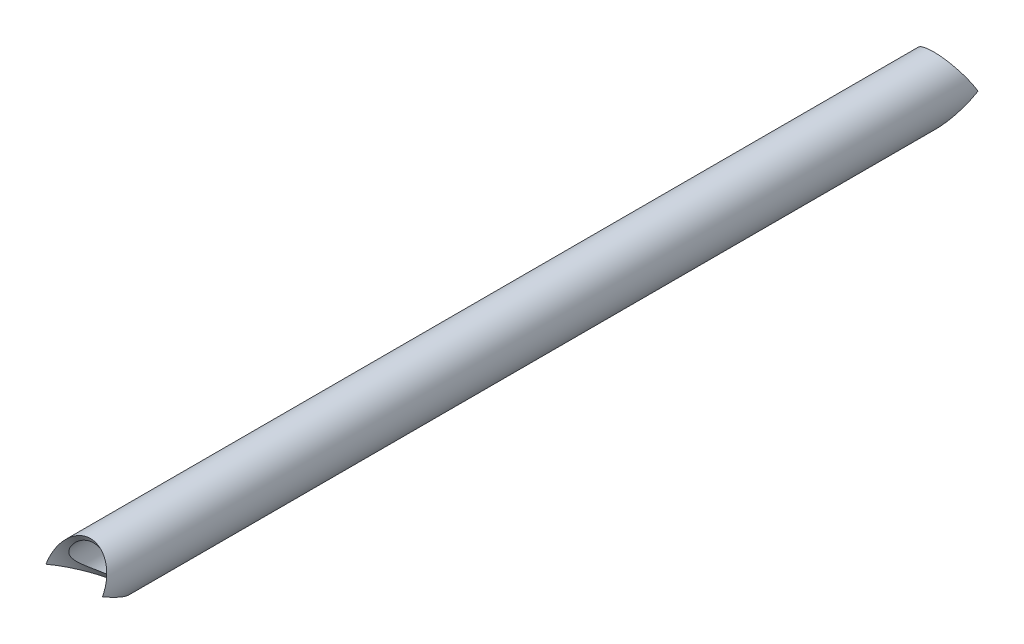
ISO-10303-21;
HEADER;
FILE_DESCRIPTION(('STEP AP214'),'2;1');
FILE_NAME('part.step','',(''),(''),'','','');
FILE_SCHEMA(('AUTOMOTIVE_DESIGN { 1 0 10303 214 1 1 1 1 }'));
ENDSEC;
DATA;
#1=APPLICATION_CONTEXT('core data for automotive mechanical design processes');
#2=APPLICATION_PROTOCOL_DEFINITION('international standard','automotive_design',2000,#1);
#3=PRODUCT_CONTEXT('',#1,'mechanical');
#4=PRODUCT('Part','Part','',(#3));
#5=PRODUCT_RELATED_PRODUCT_CATEGORY('part','',(#4));
#6=PRODUCT_DEFINITION_FORMATION('','',#4);
#7=PRODUCT_DEFINITION_CONTEXT('part definition',#1,'design');
#8=PRODUCT_DEFINITION('design','',#6,#7);
#9=PRODUCT_DEFINITION_SHAPE('','',#8);
#10=(LENGTH_UNIT() NAMED_UNIT(*) SI_UNIT(.MILLI.,.METRE.));
#11=(NAMED_UNIT(*) PLANE_ANGLE_UNIT() SI_UNIT($,.RADIAN.));
#12=(NAMED_UNIT(*) SI_UNIT($,.STERADIAN.) SOLID_ANGLE_UNIT());
#13=UNCERTAINTY_MEASURE_WITH_UNIT(LENGTH_MEASURE(1.E-05),#10,'distance_accuracy_value','');
#14=(GEOMETRIC_REPRESENTATION_CONTEXT(3) GLOBAL_UNCERTAINTY_ASSIGNED_CONTEXT((#13)) GLOBAL_UNIT_ASSIGNED_CONTEXT((#10,
#11,#12)) REPRESENTATION_CONTEXT('',''));
#15=CARTESIAN_POINT('',(0.,0.,0.));
#16=DIRECTION('',(0.,0.,1.));
#17=DIRECTION('',(1.,0.,0.));
#18=AXIS2_PLACEMENT_3D('',#15,#16,#17);
#19=CARTESIAN_POINT('',(7.95896546008941E-13,-103.327540378658,-184.657183251993));
#20=DIRECTION('',(0.,0.,1.));
#21=DIRECTION('',(1.,0.,0.));
#22=AXIS2_PLACEMENT_3D('',#19,#20,#21);
#23=CYLINDRICAL_SURFACE('',#22,10.65);
#24=CARTESIAN_POINT('',(5.33912472263224E-13,-103.327540378658,-165.343816747654));
#25=DIRECTION('',(0.,0.866025403784403,0.500000000000061));
#26=DIRECTION('',(0.,-0.500000000000061,0.866025403784403));
#27=AXIS2_PLACEMENT_3D('',#24,#25,#26);
#28=ELLIPSE('',#27,21.2999999999974,10.65);
#29=CARTESIAN_POINT('',(-10.6499999999995,-103.327540378658,-165.343816747654));
#30=VERTEX_POINT('',#29);
#31=CARTESIAN_POINT('',(10.6500000000005,-103.327540378658,-165.343816747654));
#32=VERTEX_POINT('',#31);
#33=EDGE_CURVE('E46',#30,#32,#28,.T.);
#34=ORIENTED_EDGE('',*,*,#33,.T.);
#35=CARTESIAN_POINT('',(5.33912472263224E-13,-103.327540378658,-165.343816747654));
#36=DIRECTION('',(0.,-0.500000000000061,0.866025403784403));
#37=DIRECTION('',(0.,0.866025403784403,0.500000000000061));
#38=AXIS2_PLACEMENT_3D('',#35,#36,#37);
#39=ELLIPSE('',#38,12.2975607337395,10.65);
#40=EDGE_CURVE('E54',#32,#30,#39,.T.);
#41=ORIENTED_EDGE('',*,*,#40,.T.);
#42=EDGE_LOOP('',(#34,#41));
#43=FACE_BOUND('',#42,.T.);
#44=CARTESIAN_POINT('',(5.33912472263224E-13,-103.327540378658,165.343816747654));
#45=DIRECTION('',(0.,-0.866025403784403,0.500000000000061));
#46=DIRECTION('',(0.,-0.500000000000061,-0.866025403784403));
#47=AXIS2_PLACEMENT_3D('',#44,#45,#46);
#48=ELLIPSE('',#47,21.2999999999974,10.65);
#49=CARTESIAN_POINT('',(-10.6499999999995,-103.327540378658,165.343816747654));
#50=VERTEX_POINT('',#49);
#51=CARTESIAN_POINT('',(10.6500000000005,-103.327540378658,165.343816747654));
#52=VERTEX_POINT('',#51);
#53=EDGE_CURVE('E64',#50,#52,#48,.T.);
#54=ORIENTED_EDGE('',*,*,#53,.F.);
#55=CARTESIAN_POINT('',(5.33912472263224E-13,-103.327540378658,165.343816747654));
#56=DIRECTION('',(0.,0.500000000000061,0.866025403784403));
#57=DIRECTION('',(0.,0.866025403784403,-0.500000000000061));
#58=AXIS2_PLACEMENT_3D('',#55,#56,#57);
#59=ELLIPSE('',#58,12.2975607337395,10.65);
#60=EDGE_CURVE('E62',#52,#50,#59,.T.);
#61=ORIENTED_EDGE('',*,*,#60,.F.);
#62=EDGE_LOOP('',(#54,#61));
#63=FACE_BOUND('',#62,.T.);
#64=ADVANCED_FACE('F35',(#43,#63),#23,.T.);
#65=CARTESIAN_POINT('',(7.95896546008941E-13,-103.327540378658,-184.657183251993));
#66=DIRECTION('',(0.,0.,1.));
#67=DIRECTION('',(1.,0.,0.));
#68=AXIS2_PLACEMENT_3D('',#65,#66,#67);
#69=CYLINDRICAL_SURFACE('',#68,8.65);
#70=CARTESIAN_POINT('',(8.6500000000008,-103.327540378658,-158.169789519754));
#71=CARTESIAN_POINT('',(8.64999937803406,-103.180724296699,-158.254553812038));
#72=CARTESIAN_POINT('',(8.64626274910786,-103.031296103445,-158.334805870627));
#73=CARTESIAN_POINT('',(8.63051404007087,-102.727691030107,-158.484871683247));
#74=CARTESIAN_POINT('',(8.61850310980585,-102.573514812682,-158.554686886004));
#75=CARTESIAN_POINT('',(8.58549136002989,-102.261518046835,-158.682598958172));
#76=CARTESIAN_POINT('',(8.56450206368836,-102.103702414163,-158.740710708101));
#77=CARTESIAN_POINT('',(8.51297710355504,-101.785568281509,-158.844571007119));
#78=CARTESIAN_POINT('',(8.48244146927675,-101.625249789266,-158.890319594429));
#79=CARTESIAN_POINT('',(8.41148621827999,-101.303544973736,-158.969357821427));
#80=CARTESIAN_POINT('',(8.37105601253871,-101.142157687871,-159.002634016121));
#81=CARTESIAN_POINT('',(8.28030697487776,-100.820150897027,-159.057180023658));
#82=CARTESIAN_POINT('',(8.22998781020971,-100.659531418069,-159.078449432399));
#83=CARTESIAN_POINT('',(8.11955918288921,-100.340258608292,-159.110075644565));
#84=CARTESIAN_POINT('',(8.05943008935794,-100.181609920802,-159.120410249133));
#85=CARTESIAN_POINT('',(7.92980127102047,-99.8678307830811,-159.131499808773));
#86=CARTESIAN_POINT('',(7.86029883349743,-99.7127013665945,-159.13225198458));
#87=CARTESIAN_POINT('',(7.69251740767398,-99.3659705295927,-159.124832713928));
#88=CARTESIAN_POINT('',(7.59151815094415,-99.1757360991384,-159.114215817948));
#89=CARTESIAN_POINT('',(7.37601667855964,-98.8039252937172,-159.0831105074));
#90=CARTESIAN_POINT('',(7.26151062378817,-98.6223514010809,-159.062619281063));
#91=CARTESIAN_POINT('',(7.01974442801524,-98.2687263772869,-159.014496823717));
#92=CARTESIAN_POINT('',(6.89247464409802,-98.0966826007281,-158.986860169128));
#93=CARTESIAN_POINT('',(6.62602035216192,-97.7630152066561,-158.926814802403));
#94=CARTESIAN_POINT('',(6.48683667995988,-97.6013908595618,-158.894406424912));
#95=CARTESIAN_POINT('',(6.19369921715803,-97.2853409697255,-158.825971691225));
#96=CARTESIAN_POINT('',(6.03946719637312,-97.1311886364477,-158.789876171353));
#97=CARTESIAN_POINT('',(5.71996280968018,-96.835085796674,-158.716544919854));
#98=CARTESIAN_POINT('',(5.5546903958322,-96.6931353431676,-158.679309183277));
#99=CARTESIAN_POINT('',(5.21389860048002,-96.4220971493093,-158.605207765951));
#100=CARTESIAN_POINT('',(5.03838164400033,-96.2930063843177,-158.568342000028));
#101=CARTESIAN_POINT('',(4.67787691764224,-96.0482936158515,-158.496242664673));
#102=CARTESIAN_POINT('',(4.49288897525261,-95.9326718578367,-158.461009124995));
#103=CARTESIAN_POINT('',(4.08963935720836,-95.7013898776149,-158.388840354312));
#104=CARTESIAN_POINT('',(3.87018262639335,-95.5876872173255,-158.352281476095));
#105=CARTESIAN_POINT('',(3.42170434916215,-95.3792328977603,-158.283945399876));
#106=CARTESIAN_POINT('',(3.19268197861234,-95.2844828754487,-158.252168614968));
#107=CARTESIAN_POINT('',(2.72667233822171,-95.1147913964146,-158.194467434627));
#108=CARTESIAN_POINT('',(2.48968464132816,-95.0398510036805,-158.168543353557));
#109=CARTESIAN_POINT('',(2.00954587057643,-94.9105320669982,-158.123393090708));
#110=CARTESIAN_POINT('',(1.76639521489099,-94.8561521319339,-158.104166455787));
#111=CARTESIAN_POINT('',(1.28688815578064,-94.7704940023502,-158.073718574908));
#112=CARTESIAN_POINT('',(1.05071773862643,-94.7382871368125,-158.062176291935));
#113=CARTESIAN_POINT('',(0.576287751522929,-94.6934706793493,-158.046083469594));
#114=CARTESIAN_POINT('',(0.338028232849841,-94.6808606077744,-158.0415327591));
#115=CARTESIAN_POINT('',(-0.138694398065103,-94.6753685684628,-158.039552924422));
#116=CARTESIAN_POINT('',(-0.377157454409519,-94.6824822883534,-158.042122243526));
#117=CARTESIAN_POINT('',(-0.852499060907802,-94.7163548205199,-158.054306137961));
#118=CARTESIAN_POINT('',(-1.08937763949897,-94.7431132792635,-158.063920586505));
#119=CARTESIAN_POINT('',(-1.55084699909949,-94.8146198945567,-158.089426565577));
#120=CARTESIAN_POINT('',(-1.77556361879874,-94.8586491722921,-158.105066862775));
#121=CARTESIAN_POINT('',(-2.22033596035071,-94.964236643383,-158.142195625723));
#122=CARTESIAN_POINT('',(-2.44039182888856,-95.025794284195,-158.163683907127));
#123=CARTESIAN_POINT('',(-2.87439182216376,-95.1659005896107,-158.21192308881));
#124=CARTESIAN_POINT('',(-3.08833678882493,-95.2444469007086,-158.238673260093));
#125=CARTESIAN_POINT('',(-3.50884695014992,-95.4179115519313,-158.296692885398));
#126=CARTESIAN_POINT('',(-3.71541192514849,-95.5128303788942,-158.327962473801));
#127=CARTESIAN_POINT('',(-4.12561504865866,-95.7212148758505,-158.395031462038));
#128=CARTESIAN_POINT('',(-4.32901148650071,-95.835123437807,-158.430932760268));
#129=CARTESIAN_POINT('',(-4.72560996425141,-96.0787283889239,-158.505363145841));
#130=CARTESIAN_POINT('',(-4.91881176220131,-96.2084251525588,-158.543892295503));
#131=CARTESIAN_POINT('',(-5.29426000335201,-96.4830183554264,-158.622226257314));
#132=CARTESIAN_POINT('',(-5.47649012979044,-96.6279365940557,-158.662032840722));
#133=CARTESIAN_POINT('',(-5.82873985001061,-96.9320391578018,-158.74118278452));
#134=CARTESIAN_POINT('',(-5.99875927649417,-97.0912236783131,-158.780526138557));
#135=CARTESIAN_POINT('',(-6.3351876587697,-97.4327427072261,-158.858947720757));
#136=CARTESIAN_POINT('',(-6.50081325634362,-97.615884819436,-158.897877805471));
#137=CARTESIAN_POINT('',(-6.81634213928482,-97.9963986397084,-158.970062290325));
#138=CARTESIAN_POINT('',(-6.96624167784245,-98.193773720029,-159.003315339061));
#139=CARTESIAN_POINT('',(-7.24880778216957,-98.601166616171,-159.060509557127));
#140=CARTESIAN_POINT('',(-7.38151120832191,-98.8111559288453,-159.084470871023));
#141=CARTESIAN_POINT('',(-7.62872444595239,-99.2425978528779,-159.118913729354));
#142=CARTESIAN_POINT('',(-7.7432466153069,-99.4640425410581,-159.129404464472));
#143=CARTESIAN_POINT('',(-7.91587661528727,-99.8364815794788,-159.131660792954));
#144=CARTESIAN_POINT('',(-7.9796532846007,-99.9848392003673,-159.128717442529));
#145=CARTESIAN_POINT('',(-8.09865941914346,-100.28448705044,-159.11386568408));
#146=CARTESIAN_POINT('',(-8.15389168150537,-100.435776301586,-159.10196021745));
#147=CARTESIAN_POINT('',(-8.25543809691465,-100.739897889786,-159.068058126632));
#148=CARTESIAN_POINT('',(-8.30176915263711,-100.892726710425,-159.046080902158));
#149=CARTESIAN_POINT('',(-8.3854938845684,-101.19888471671,-158.991192865948));
#150=CARTESIAN_POINT('',(-8.42288752849199,-101.352213904162,-158.958282014718));
#151=CARTESIAN_POINT('',(-8.48887463244742,-101.658377748636,-158.881026848016));
#152=CARTESIAN_POINT('',(-8.51744234753692,-101.81120969583,-158.83664976459));
#153=CARTESIAN_POINT('',(-8.56590540255613,-102.114543369102,-158.736664024524));
#154=CARTESIAN_POINT('',(-8.5858008185466,-102.265045115606,-158.681055466398));
#155=CARTESIAN_POINT('',(-8.61742448664778,-102.562731851217,-158.559202943871));
#156=CARTESIAN_POINT('',(-8.62914387610698,-102.709913074293,-158.492947533877));
#157=CARTESIAN_POINT('',(-8.64501885033538,-103.000021072934,-158.350865710912));
#158=CARTESIAN_POINT('',(-8.64917188259922,-103.142946396787,-158.275036077306));
#159=CARTESIAN_POINT('',(-8.65091176420805,-103.484490242439,-158.080636711664));
#160=CARTESIAN_POINT('',(-8.64490991978731,-103.680647580873,-157.957703743245));
#161=CARTESIAN_POINT('',(-8.6208040453725,-104.063065952511,-157.698392769579));
#162=CARTESIAN_POINT('',(-8.60269349220063,-104.249321593078,-157.562007551141));
#163=CARTESIAN_POINT('',(-8.55591593176066,-104.61304776465,-157.278573186889));
#164=CARTESIAN_POINT('',(-8.5272145391973,-104.790487519854,-157.131490572831));
#165=CARTESIAN_POINT('',(-8.46048539057249,-105.136909100512,-156.829617762131));
#166=CARTESIAN_POINT('',(-8.42245385331453,-105.305887463331,-156.674824460923));
#167=CARTESIAN_POINT('',(-8.33930780952858,-105.630942586702,-156.364734704409));
#168=CARTESIAN_POINT('',(-8.2944623361027,-105.787259894665,-156.209616629036));
#169=CARTESIAN_POINT('',(-8.19738755509969,-106.093611441076,-155.895606806495));
#170=CARTESIAN_POINT('',(-8.14515935111348,-106.243646614258,-155.736715626289));
#171=CARTESIAN_POINT('',(-8.03358147622551,-106.538288577141,-155.416145966346));
#172=CARTESIAN_POINT('',(-7.9742252188266,-106.682890181606,-155.254465028759));
#173=CARTESIAN_POINT('',(-7.84858289044733,-106.967098976708,-154.929390007544));
#174=CARTESIAN_POINT('',(-7.78229605383257,-107.106705613251,-154.76599573644));
#175=CARTESIAN_POINT('',(-7.64278789689112,-107.381432345415,-154.438214400526));
#176=CARTESIAN_POINT('',(-7.56956237191814,-107.51654965279,-154.273826790994));
#177=CARTESIAN_POINT('',(-7.41613086611494,-107.782546269707,-153.944852851689));
#178=CARTESIAN_POINT('',(-7.33592422353043,-107.913425175865,-153.780266504538));
#179=CARTESIAN_POINT('',(-7.16842967186045,-108.171062672443,-153.45168082809));
#180=CARTESIAN_POINT('',(-7.08114669097887,-108.297824045729,-153.287681171914));
#181=CARTESIAN_POINT('',(-6.89920629382288,-108.547434846444,-152.960798311847));
#182=CARTESIAN_POINT('',(-6.80454875726898,-108.670284210023,-152.797915126214));
#183=CARTESIAN_POINT('',(-6.56519981119175,-108.964065146199,-152.404283892078));
#184=CARTESIAN_POINT('',(-6.41648661666439,-109.132974471902,-152.174449414939));
#185=CARTESIAN_POINT('',(-6.10210401419077,-109.462578998742,-151.720441483466));
#186=CARTESIAN_POINT('',(-5.93643204735793,-109.62327295477,-151.496268889828));
#187=CARTESIAN_POINT('',(-5.58706670598616,-109.935256053793,-151.056650105889));
#188=CARTESIAN_POINT('',(-5.40341885193462,-110.086567444865,-150.841183730296));
#189=CARTESIAN_POINT('',(-5.01605964050909,-110.378816276582,-150.421588491305));
#190=CARTESIAN_POINT('',(-4.8123586935434,-110.519759034309,-150.217453830321));
#191=CARTESIAN_POINT('',(-4.46395431537738,-110.73837637967,-149.898697996367));
#192=CARTESIAN_POINT('',(-4.32596965085759,-110.819866914022,-149.779349834344));
#193=CARTESIAN_POINT('',(-4.04104693269419,-110.977308595896,-149.547914824573));
#194=CARTESIAN_POINT('',(-3.89410768993995,-111.05325900477,-149.435828945307));
#195=CARTESIAN_POINT('',(-3.43953622820747,-111.271403809869,-149.112868323666));
#196=CARTESIAN_POINT('',(-3.11767000653529,-111.404200907743,-148.914838120572));
#197=CARTESIAN_POINT('',(-2.51329904826334,-111.60902720045,-148.608135136498));
#198=CARTESIAN_POINT('',(-2.23837288737241,-111.68800742512,-148.489382239451));
#199=CARTESIAN_POINT('',(-1.8114918358848,-111.78699632269,-148.340230769187));
#200=CARTESIAN_POINT('',(-1.66677696284385,-111.816746490483,-148.295342080614));
#201=CARTESIAN_POINT('',(-1.37323763265746,-111.869139042039,-148.216221017434));
#202=CARTESIAN_POINT('',(-1.22441515227349,-111.891784782047,-148.181983611057));
#203=CARTESIAN_POINT('',(-0.922228530534153,-111.92959793131,-148.124783054174));
#204=CARTESIAN_POINT('',(-0.768835207762047,-111.944694647389,-148.101926488186));
#205=CARTESIAN_POINT('',(-0.460111209938452,-111.966680344282,-148.068631454903));
#206=CARTESIAN_POINT('',(-0.304780550296065,-111.973569390335,-148.058192888903));
#207=CARTESIAN_POINT('',(0.00631804623179663,-111.978936613017,-148.050060702468));
#208=CARTESIAN_POINT('',(0.162085851107407,-111.977417102303,-148.052363577676));
#209=CARTESIAN_POINT('',(0.472597570433432,-111.966017450406,-148.06963393631));
#210=CARTESIAN_POINT('',(0.627341552834955,-111.956137869807,-148.084600570568));
#211=CARTESIAN_POINT('',(0.914629127249672,-111.930098311039,-148.124021691108));
#212=CARTESIAN_POINT('',(1.04746675019326,-111.91491027634,-148.147007166989));
#213=CARTESIAN_POINT('',(1.31053948151417,-111.878717870489,-148.201737163545));
#214=CARTESIAN_POINT('',(1.44077378597111,-111.857711731536,-148.233484346408));
#215=CARTESIAN_POINT('',(1.82650942834381,-111.786537386547,-148.340945568136));
#216=CARTESIAN_POINT('',(2.07716005820174,-111.728202180101,-148.428896105986));
#217=CARTESIAN_POINT('',(2.6770104496419,-111.561247115626,-148.679841546537));
#218=CARTESIAN_POINT('',(3.01657143771898,-111.441900151343,-148.85864494834));
#219=CARTESIAN_POINT('',(3.49694388024381,-111.241087387271,-149.157554671786));
#220=CARTESIAN_POINT('',(3.65245291749765,-111.170394301879,-149.262490672566));
#221=CARTESIAN_POINT('',(3.95415605806268,-111.02268825471,-149.4809699569));
#222=CARTESIAN_POINT('',(4.10035178316947,-110.945676398639,-149.594511734284));
#223=CARTESIAN_POINT('',(4.47217067277788,-110.736454003811,-149.901738381406));
#224=CARTESIAN_POINT('',(4.69046621582154,-110.599772252971,-150.101242865483));
#225=CARTESIAN_POINT('',(5.1054204024205,-110.314712608095,-150.513982184282));
#226=CARTESIAN_POINT('',(5.30206445824779,-110.166326942669,-150.727226124491));
#227=CARTESIAN_POINT('',(5.67619689273802,-109.859160627466,-151.1643842946));
#228=CARTESIAN_POINT('',(5.85361633779502,-109.700345650149,-151.388333025582));
#229=CARTESIAN_POINT('',(6.1902113126006,-109.373922501287,-151.843247922582));
#230=CARTESIAN_POINT('',(6.34939068740995,-109.206316193879,-152.074212596584));
#231=CARTESIAN_POINT('',(6.61712450602785,-108.901368184084,-152.488481148617));
#232=CARTESIAN_POINT('',(6.72902472853619,-108.765672649512,-152.670852702975));
#233=CARTESIAN_POINT('',(6.94326792392784,-108.48933327863,-153.037486843968));
#234=CARTESIAN_POINT('',(7.04560988610157,-108.348688921182,-153.221749628305));
#235=CARTESIAN_POINT('',(7.24122557898546,-108.062227649819,-153.591407563421));
#236=CARTESIAN_POINT('',(7.3344900619312,-107.916405663289,-153.776803668649));
#237=CARTESIAN_POINT('',(7.51210861764736,-107.619469408038,-154.147609115808));
#238=CARTESIAN_POINT('',(7.59646314201739,-107.46835540806,-154.333018456591));
#239=CARTESIAN_POINT('',(7.75620337110453,-107.160785238078,-154.702402158736));
#240=CARTESIAN_POINT('',(7.83161100983237,-107.004343395916,-154.886378951062));
#241=CARTESIAN_POINT('',(7.97368173187833,-106.685132953883,-155.252263242759));
#242=CARTESIAN_POINT('',(8.04034383363487,-106.522363646498,-155.434170507767));
#243=CARTESIAN_POINT('',(8.16459670931791,-106.18993611332,-155.794291758741));
#244=CARTESIAN_POINT('',(8.22219981237345,-106.020287652741,-155.972510472611));
#245=CARTESIAN_POINT('',(8.32794134031561,-105.672930442118,-156.323768111229));
#246=CARTESIAN_POINT('',(8.37608284212309,-105.495224335641,-156.496808704336));
#247=CARTESIAN_POINT('',(8.45472823516548,-105.161709857086,-156.806582126685));
#248=CARTESIAN_POINT('',(8.48684042867082,-105.007352499218,-156.944464160928));
#249=CARTESIAN_POINT('',(8.54328935211273,-104.691521887395,-157.213577397615));
#250=CARTESIAN_POINT('',(8.56762596647589,-104.530048527711,-157.344808501177));
#251=CARTESIAN_POINT('',(8.60751619567207,-104.199759172313,-157.598297745706));
#252=CARTESIAN_POINT('',(8.62309164938126,-104.030962573905,-157.720577531033));
#253=CARTESIAN_POINT('',(8.64433263886661,-103.685277201269,-157.954115038791));
#254=CARTESIAN_POINT('',(8.65000076614843,-103.508390555619,-158.065375636378));
#255=CARTESIAN_POINT('',(8.6500000000008,-103.327540378658,-158.169789519754));
#256=B_SPLINE_CURVE_WITH_KNOTS('',3,(#70,#71,#72,#73,#74,#75,#76,#77,#78,#79,#80,#81,#82,#83,
#84,#85,#86,#87,#88,#89,#90,#91,#92,#93,#94,#95,#96,#97,#98,#99,#100,#101,#102,#103,#104,#105,
#106,#107,#108,#109,#110,#111,#112,#113,#114,#115,#116,#117,#118,#119,#120,#121,#122,#123,#124,
#125,#126,#127,#128,#129,#130,#131,#132,#133,#134,#135,#136,#137,#138,#139,#140,#141,#142,#143,
#144,#145,#146,#147,#148,#149,#150,#151,#152,#153,#154,#155,#156,#157,#158,#159,#160,#161,#162,
#163,#164,#165,#166,#167,#168,#169,#170,#171,#172,#173,#174,#175,#176,#177,#178,#179,#180,#181,
#182,#183,#184,#185,#186,#187,#188,#189,#190,#191,#192,#193,#194,#195,#196,#197,#198,#199,#200,
#201,#202,#203,#204,#205,#206,#207,#208,#209,#210,#211,#212,#213,#214,#215,#216,#217,#218,#219,
#220,#221,#222,#223,#224,#225,#226,#227,#228,#229,#230,#231,#232,#233,#234,#235,#236,#237,#238,
#239,#240,#241,#242,#243,#244,#245,#246,#247,#248,#249,#250,#251,#252,#253,#254,#255),
.UNSPECIFIED.,.T.,.F.,(4,2,2,2,2,2,2,2,2,2,2,2,2,2,2,2,2,2,2,2,2,2,2,2,2,2,2,2,2,2,2,2,2,2,2,2,
2,2,2,2,2,2,2,2,2,2,2,2,2,2,2,2,2,2,2,2,2,2,2,2,2,2,2,2,2,2,2,2,2,2,2,2,2,2,2,2,2,2,2,2,2,2,2,2,
2,2,2,2,2,2,2,2,4),(0.,0.508445067700307,1.01681949312018,1.52454340032974,2.03226573787232,
2.54053382673726,3.04881902097632,3.55813412185309,4.06759693996523,4.71359002947242,
5.35976717786669,6.00643624012404,6.65305997254465,7.31551844685063,7.97797979789324,
8.64028496620534,9.30260220250547,10.051209187915,10.7998808036043,11.5485926227775,
12.2972537751967,13.0122575701415,13.7272438644487,14.4420738478246,15.156890967233,
15.8446653307736,16.5324180161264,17.2200754854147,17.9077534057856,18.614582303783,
19.3214279700605,20.029300114905,20.7371819564202,21.4861817527538,22.2353595985673,
22.9829040159489,23.7299381285008,24.2140392664682,24.6979815901782,25.180995661056,
25.6640114767329,26.1484232132305,26.6328307010898,27.1177624646541,27.6028577893436,
28.2964167818697,28.9903497083938,29.6865557409422,30.38304439003,31.0569944659833,
31.7308439043491,32.4053208577867,33.0798724008737,33.7548353491974,34.4298623484519,
35.1044232089347,35.778995073854,36.7434305731187,37.7080118098812,38.6702106916393,
39.6319126633935,40.2309613246267,40.8300897097657,42.0261773485565,42.951559231629,
43.4142860297684,43.8767938980604,44.3435554209342,44.8103132336662,45.2769426775156,
45.7435408340743,46.1500870679643,46.5567569645803,47.3697458590113,48.5683011522662,
49.1693990091057,49.770391904598,50.7462014804332,51.7226645377541,52.7025204724633,
53.6821694691645,54.4420360299658,55.20198284982,55.9626959419761,56.7233704590091,
57.482139802863,58.2409942350119,58.9988067717564,59.7563724579487,60.3844095628079,
61.0124560021508,61.6389298975943,62.2652398987969),.UNSPECIFIED.);
#257=CARTESIAN_POINT('',(8.6500000000008,-103.327540378658,-158.169789519754));
#258=VERTEX_POINT('',#257);
#259=EDGE_CURVE('E11',#258,#258,#256,.T.);
#260=ORIENTED_EDGE('',*,*,#259,.F.);
#261=EDGE_LOOP('',(#260));
#262=FACE_BOUND('',#261,.T.);
#263=CARTESIAN_POINT('',(8.6500000000008,-103.327540378658,158.169789519754));
#264=CARTESIAN_POINT('',(8.64999937803406,-103.180724296699,158.254553812038));
#265=CARTESIAN_POINT('',(8.64626274910786,-103.031296103445,158.334805870627));
#266=CARTESIAN_POINT('',(8.63051404007087,-102.727691030107,158.484871683247));
#267=CARTESIAN_POINT('',(8.61850310980585,-102.573514812682,158.554686886004));
#268=CARTESIAN_POINT('',(8.58549136002989,-102.261518046835,158.682598958172));
#269=CARTESIAN_POINT('',(8.56450206368836,-102.103702414163,158.740710708101));
#270=CARTESIAN_POINT('',(8.51297710355504,-101.785568281509,158.844571007119));
#271=CARTESIAN_POINT('',(8.48244146927675,-101.625249789266,158.890319594429));
#272=CARTESIAN_POINT('',(8.41148621827999,-101.303544973736,158.969357821427));
#273=CARTESIAN_POINT('',(8.37105601253871,-101.142157687871,159.002634016121));
#274=CARTESIAN_POINT('',(8.28030697487776,-100.820150897027,159.057180023658));
#275=CARTESIAN_POINT('',(8.22998781020971,-100.659531418069,159.078449432399));
#276=CARTESIAN_POINT('',(8.11955918288921,-100.340258608292,159.110075644565));
#277=CARTESIAN_POINT('',(8.05943008935794,-100.181609920802,159.120410249133));
#278=CARTESIAN_POINT('',(7.92980127102047,-99.8678307830811,159.131499808773));
#279=CARTESIAN_POINT('',(7.86029883349743,-99.7127013665945,159.13225198458));
#280=CARTESIAN_POINT('',(7.69251740767398,-99.3659705295927,159.124832713928));
#281=CARTESIAN_POINT('',(7.59151815094415,-99.1757360991384,159.114215817948));
#282=CARTESIAN_POINT('',(7.37601667855964,-98.8039252937172,159.0831105074));
#283=CARTESIAN_POINT('',(7.26151062378817,-98.6223514010809,159.062619281063));
#284=CARTESIAN_POINT('',(7.01974442801524,-98.2687263772869,159.014496823717));
#285=CARTESIAN_POINT('',(6.89247464409802,-98.0966826007281,158.986860169128));
#286=CARTESIAN_POINT('',(6.62602035216192,-97.7630152066561,158.926814802403));
#287=CARTESIAN_POINT('',(6.48683667995988,-97.6013908595618,158.894406424912));
#288=CARTESIAN_POINT('',(6.19369921715803,-97.2853409697255,158.825971691225));
#289=CARTESIAN_POINT('',(6.03946719637312,-97.1311886364477,158.789876171353));
#290=CARTESIAN_POINT('',(5.71996280968018,-96.835085796674,158.716544919854));
#291=CARTESIAN_POINT('',(5.5546903958322,-96.6931353431676,158.679309183277));
#292=CARTESIAN_POINT('',(5.21389860048002,-96.4220971493093,158.605207765951));
#293=CARTESIAN_POINT('',(5.03838164400033,-96.2930063843177,158.568342000028));
#294=CARTESIAN_POINT('',(4.67787691764224,-96.0482936158515,158.496242664673));
#295=CARTESIAN_POINT('',(4.49288897525261,-95.9326718578367,158.461009124995));
#296=CARTESIAN_POINT('',(4.08963935720836,-95.7013898776149,158.388840354312));
#297=CARTESIAN_POINT('',(3.87018262639335,-95.5876872173255,158.352281476095));
#298=CARTESIAN_POINT('',(3.42170434916215,-95.3792328977603,158.283945399876));
#299=CARTESIAN_POINT('',(3.19268197861234,-95.2844828754487,158.252168614968));
#300=CARTESIAN_POINT('',(2.72667233822171,-95.1147913964146,158.194467434627));
#301=CARTESIAN_POINT('',(2.48968464132816,-95.0398510036805,158.168543353557));
#302=CARTESIAN_POINT('',(2.00954587057643,-94.9105320669982,158.123393090708));
#303=CARTESIAN_POINT('',(1.76639521489099,-94.8561521319339,158.104166455787));
#304=CARTESIAN_POINT('',(1.28688815578064,-94.7704940023502,158.073718574908));
#305=CARTESIAN_POINT('',(1.05071773862643,-94.7382871368125,158.062176291935));
#306=CARTESIAN_POINT('',(0.576287751522929,-94.6934706793493,158.046083469594));
#307=CARTESIAN_POINT('',(0.338028232849841,-94.6808606077744,158.0415327591));
#308=CARTESIAN_POINT('',(-0.138694398065103,-94.6753685684628,158.039552924422));
#309=CARTESIAN_POINT('',(-0.377157454409519,-94.6824822883534,158.042122243526));
#310=CARTESIAN_POINT('',(-0.852499060907802,-94.7163548205199,158.054306137961));
#311=CARTESIAN_POINT('',(-1.08937763949897,-94.7431132792635,158.063920586505));
#312=CARTESIAN_POINT('',(-1.55084699909949,-94.8146198945567,158.089426565577));
#313=CARTESIAN_POINT('',(-1.77556361879874,-94.8586491722921,158.105066862775));
#314=CARTESIAN_POINT('',(-2.22033596035071,-94.964236643383,158.142195625723));
#315=CARTESIAN_POINT('',(-2.44039182888856,-95.025794284195,158.163683907127));
#316=CARTESIAN_POINT('',(-2.87439182216376,-95.1659005896107,158.21192308881));
#317=CARTESIAN_POINT('',(-3.08833678882493,-95.2444469007086,158.238673260093));
#318=CARTESIAN_POINT('',(-3.50884695014992,-95.4179115519313,158.296692885398));
#319=CARTESIAN_POINT('',(-3.71541192514849,-95.5128303788942,158.327962473801));
#320=CARTESIAN_POINT('',(-4.12561504865866,-95.7212148758505,158.395031462038));
#321=CARTESIAN_POINT('',(-4.32901148650071,-95.835123437807,158.430932760268));
#322=CARTESIAN_POINT('',(-4.72560996425141,-96.0787283889239,158.505363145841));
#323=CARTESIAN_POINT('',(-4.91881176220131,-96.2084251525588,158.543892295503));
#324=CARTESIAN_POINT('',(-5.29426000335201,-96.4830183554264,158.622226257314));
#325=CARTESIAN_POINT('',(-5.47649012979044,-96.6279365940557,158.662032840722));
#326=CARTESIAN_POINT('',(-5.82873985001061,-96.9320391578018,158.74118278452));
#327=CARTESIAN_POINT('',(-5.99875927649417,-97.0912236783131,158.780526138557));
#328=CARTESIAN_POINT('',(-6.3351876587697,-97.4327427072261,158.858947720757));
#329=CARTESIAN_POINT('',(-6.50081325634362,-97.615884819436,158.897877805471));
#330=CARTESIAN_POINT('',(-6.81634213928482,-97.9963986397084,158.970062290325));
#331=CARTESIAN_POINT('',(-6.96624167784245,-98.193773720029,159.003315339061));
#332=CARTESIAN_POINT('',(-7.24880778216957,-98.601166616171,159.060509557127));
#333=CARTESIAN_POINT('',(-7.38151120832191,-98.8111559288453,159.084470871023));
#334=CARTESIAN_POINT('',(-7.62872444595239,-99.2425978528779,159.118913729354));
#335=CARTESIAN_POINT('',(-7.7432466153069,-99.4640425410581,159.129404464472));
#336=CARTESIAN_POINT('',(-7.91587661528727,-99.8364815794788,159.131660792954));
#337=CARTESIAN_POINT('',(-7.9796532846007,-99.9848392003673,159.128717442529));
#338=CARTESIAN_POINT('',(-8.09865941914346,-100.28448705044,159.11386568408));
#339=CARTESIAN_POINT('',(-8.15389168150537,-100.435776301586,159.10196021745));
#340=CARTESIAN_POINT('',(-8.25543809691465,-100.739897889786,159.068058126632));
#341=CARTESIAN_POINT('',(-8.30176915263711,-100.892726710425,159.046080902158));
#342=CARTESIAN_POINT('',(-8.3854938845684,-101.19888471671,158.991192865948));
#343=CARTESIAN_POINT('',(-8.42288752849199,-101.352213904162,158.958282014718));
#344=CARTESIAN_POINT('',(-8.48887463244742,-101.658377748636,158.881026848016));
#345=CARTESIAN_POINT('',(-8.51744234753692,-101.81120969583,158.83664976459));
#346=CARTESIAN_POINT('',(-8.56590540255613,-102.114543369102,158.736664024524));
#347=CARTESIAN_POINT('',(-8.5858008185466,-102.265045115606,158.681055466398));
#348=CARTESIAN_POINT('',(-8.61742448664778,-102.562731851217,158.559202943871));
#349=CARTESIAN_POINT('',(-8.62914387610698,-102.709913074293,158.492947533877));
#350=CARTESIAN_POINT('',(-8.64501885033538,-103.000021072934,158.350865710912));
#351=CARTESIAN_POINT('',(-8.64917188259922,-103.142946396787,158.275036077306));
#352=CARTESIAN_POINT('',(-8.65091176420805,-103.484490242439,158.080636711664));
#353=CARTESIAN_POINT('',(-8.64490991978731,-103.680647580873,157.957703743245));
#354=CARTESIAN_POINT('',(-8.6208040453725,-104.063065952511,157.698392769579));
#355=CARTESIAN_POINT('',(-8.60269349220063,-104.249321593078,157.562007551141));
#356=CARTESIAN_POINT('',(-8.55591593176066,-104.61304776465,157.278573186889));
#357=CARTESIAN_POINT('',(-8.5272145391973,-104.790487519854,157.131490572831));
#358=CARTESIAN_POINT('',(-8.46048539057249,-105.136909100512,156.829617762131));
#359=CARTESIAN_POINT('',(-8.42245385331453,-105.305887463331,156.674824460923));
#360=CARTESIAN_POINT('',(-8.33930780952858,-105.630942586702,156.364734704409));
#361=CARTESIAN_POINT('',(-8.2944623361027,-105.787259894665,156.209616629036));
#362=CARTESIAN_POINT('',(-8.19738755509969,-106.093611441076,155.895606806495));
#363=CARTESIAN_POINT('',(-8.14515935111348,-106.243646614258,155.736715626289));
#364=CARTESIAN_POINT('',(-8.03358147622551,-106.538288577141,155.416145966346));
#365=CARTESIAN_POINT('',(-7.9742252188266,-106.682890181606,155.254465028759));
#366=CARTESIAN_POINT('',(-7.84858289044733,-106.967098976708,154.929390007544));
#367=CARTESIAN_POINT('',(-7.78229605383257,-107.106705613251,154.76599573644));
#368=CARTESIAN_POINT('',(-7.64278789689112,-107.381432345415,154.438214400526));
#369=CARTESIAN_POINT('',(-7.56956237191814,-107.51654965279,154.273826790994));
#370=CARTESIAN_POINT('',(-7.41613086611494,-107.782546269707,153.944852851689));
#371=CARTESIAN_POINT('',(-7.33592422353043,-107.913425175865,153.780266504538));
#372=CARTESIAN_POINT('',(-7.16842967186045,-108.171062672443,153.45168082809));
#373=CARTESIAN_POINT('',(-7.08114669097887,-108.297824045729,153.287681171914));
#374=CARTESIAN_POINT('',(-6.89920629382288,-108.547434846444,152.960798311847));
#375=CARTESIAN_POINT('',(-6.80454875726898,-108.670284210023,152.797915126214));
#376=CARTESIAN_POINT('',(-6.56519981119175,-108.964065146199,152.404283892078));
#377=CARTESIAN_POINT('',(-6.41648661666439,-109.132974471902,152.174449414939));
#378=CARTESIAN_POINT('',(-6.10210401419077,-109.462578998742,151.720441483466));
#379=CARTESIAN_POINT('',(-5.93643204735793,-109.62327295477,151.496268889828));
#380=CARTESIAN_POINT('',(-5.58706670598616,-109.935256053793,151.056650105889));
#381=CARTESIAN_POINT('',(-5.40341885193462,-110.086567444865,150.841183730296));
#382=CARTESIAN_POINT('',(-5.01605964050909,-110.378816276582,150.421588491305));
#383=CARTESIAN_POINT('',(-4.8123586935434,-110.519759034309,150.217453830321));
#384=CARTESIAN_POINT('',(-4.46395431537738,-110.73837637967,149.898697996367));
#385=CARTESIAN_POINT('',(-4.32596965085759,-110.819866914022,149.779349834344));
#386=CARTESIAN_POINT('',(-4.04104693269419,-110.977308595896,149.547914824573));
#387=CARTESIAN_POINT('',(-3.89410768993995,-111.05325900477,149.435828945307));
#388=CARTESIAN_POINT('',(-3.43953622820747,-111.271403809869,149.112868323666));
#389=CARTESIAN_POINT('',(-3.11767000653529,-111.404200907743,148.914838120572));
#390=CARTESIAN_POINT('',(-2.51329904826334,-111.60902720045,148.608135136498));
#391=CARTESIAN_POINT('',(-2.23837288737241,-111.68800742512,148.489382239451));
#392=CARTESIAN_POINT('',(-1.8114918358848,-111.78699632269,148.340230769187));
#393=CARTESIAN_POINT('',(-1.66677696284385,-111.816746490483,148.295342080614));
#394=CARTESIAN_POINT('',(-1.37323763265746,-111.869139042039,148.216221017434));
#395=CARTESIAN_POINT('',(-1.22441515227349,-111.891784782047,148.181983611057));
#396=CARTESIAN_POINT('',(-0.922228530534153,-111.92959793131,148.124783054174));
#397=CARTESIAN_POINT('',(-0.768835207762047,-111.944694647389,148.101926488186));
#398=CARTESIAN_POINT('',(-0.460111209938452,-111.966680344282,148.068631454903));
#399=CARTESIAN_POINT('',(-0.304780550296065,-111.973569390335,148.058192888903));
#400=CARTESIAN_POINT('',(0.00631804623179663,-111.978936613017,148.050060702468));
#401=CARTESIAN_POINT('',(0.162085851107407,-111.977417102303,148.052363577676));
#402=CARTESIAN_POINT('',(0.472597570433432,-111.966017450406,148.06963393631));
#403=CARTESIAN_POINT('',(0.627341552834955,-111.956137869807,148.084600570568));
#404=CARTESIAN_POINT('',(0.914629127249672,-111.930098311039,148.124021691108));
#405=CARTESIAN_POINT('',(1.04746675019326,-111.91491027634,148.147007166989));
#406=CARTESIAN_POINT('',(1.31053948151417,-111.878717870489,148.201737163545));
#407=CARTESIAN_POINT('',(1.44077378597111,-111.857711731536,148.233484346408));
#408=CARTESIAN_POINT('',(1.82650942834381,-111.786537386547,148.340945568136));
#409=CARTESIAN_POINT('',(2.07716005820174,-111.728202180101,148.428896105986));
#410=CARTESIAN_POINT('',(2.6770104496419,-111.561247115626,148.679841546537));
#411=CARTESIAN_POINT('',(3.01657143771898,-111.441900151343,148.85864494834));
#412=CARTESIAN_POINT('',(3.49694388024381,-111.241087387271,149.157554671786));
#413=CARTESIAN_POINT('',(3.65245291749765,-111.170394301879,149.262490672566));
#414=CARTESIAN_POINT('',(3.95415605806268,-111.02268825471,149.4809699569));
#415=CARTESIAN_POINT('',(4.10035178316947,-110.945676398639,149.594511734284));
#416=CARTESIAN_POINT('',(4.47217067277788,-110.736454003811,149.901738381406));
#417=CARTESIAN_POINT('',(4.69046621582154,-110.599772252971,150.101242865483));
#418=CARTESIAN_POINT('',(5.1054204024205,-110.314712608095,150.513982184282));
#419=CARTESIAN_POINT('',(5.30206445824779,-110.166326942669,150.727226124491));
#420=CARTESIAN_POINT('',(5.67619689273802,-109.859160627466,151.1643842946));
#421=CARTESIAN_POINT('',(5.85361633779502,-109.700345650149,151.388333025582));
#422=CARTESIAN_POINT('',(6.1902113126006,-109.373922501287,151.843247922582));
#423=CARTESIAN_POINT('',(6.34939068740995,-109.206316193879,152.074212596584));
#424=CARTESIAN_POINT('',(6.61712450602785,-108.901368184084,152.488481148617));
#425=CARTESIAN_POINT('',(6.72902472853619,-108.765672649512,152.670852702975));
#426=CARTESIAN_POINT('',(6.94326792392784,-108.48933327863,153.037486843968));
#427=CARTESIAN_POINT('',(7.04560988610157,-108.348688921182,153.221749628305));
#428=CARTESIAN_POINT('',(7.24122557898546,-108.062227649819,153.591407563421));
#429=CARTESIAN_POINT('',(7.3344900619312,-107.916405663289,153.776803668649));
#430=CARTESIAN_POINT('',(7.51210861764736,-107.619469408038,154.147609115808));
#431=CARTESIAN_POINT('',(7.59646314201739,-107.46835540806,154.333018456591));
#432=CARTESIAN_POINT('',(7.75620337110453,-107.160785238078,154.702402158736));
#433=CARTESIAN_POINT('',(7.83161100983237,-107.004343395916,154.886378951062));
#434=CARTESIAN_POINT('',(7.97368173187833,-106.685132953883,155.252263242759));
#435=CARTESIAN_POINT('',(8.04034383363487,-106.522363646498,155.434170507767));
#436=CARTESIAN_POINT('',(8.16459670931791,-106.18993611332,155.794291758741));
#437=CARTESIAN_POINT('',(8.22219981237345,-106.020287652741,155.972510472611));
#438=CARTESIAN_POINT('',(8.32794134031561,-105.672930442118,156.323768111229));
#439=CARTESIAN_POINT('',(8.37608284212309,-105.495224335641,156.496808704336));
#440=CARTESIAN_POINT('',(8.45472823516548,-105.161709857086,156.806582126685));
#441=CARTESIAN_POINT('',(8.48684042867082,-105.007352499218,156.944464160928));
#442=CARTESIAN_POINT('',(8.54328935211273,-104.691521887395,157.213577397615));
#443=CARTESIAN_POINT('',(8.56762596647589,-104.530048527711,157.344808501177));
#444=CARTESIAN_POINT('',(8.60751619567207,-104.199759172313,157.598297745706));
#445=CARTESIAN_POINT('',(8.62309164938126,-104.030962573905,157.720577531033));
#446=CARTESIAN_POINT('',(8.64433263886661,-103.685277201269,157.954115038791));
#447=CARTESIAN_POINT('',(8.65000076614843,-103.508390555619,158.065375636378));
#448=CARTESIAN_POINT('',(8.6500000000008,-103.327540378658,158.169789519754));
#449=B_SPLINE_CURVE_WITH_KNOTS('',3,(#263,#264,#265,#266,#267,#268,#269,#270,#271,#272,#273,
#274,#275,#276,#277,#278,#279,#280,#281,#282,#283,#284,#285,#286,#287,#288,#289,#290,#291,#292,
#293,#294,#295,#296,#297,#298,#299,#300,#301,#302,#303,#304,#305,#306,#307,#308,#309,#310,#311,
#312,#313,#314,#315,#316,#317,#318,#319,#320,#321,#322,#323,#324,#325,#326,#327,#328,#329,#330,
#331,#332,#333,#334,#335,#336,#337,#338,#339,#340,#341,#342,#343,#344,#345,#346,#347,#348,#349,
#350,#351,#352,#353,#354,#355,#356,#357,#358,#359,#360,#361,#362,#363,#364,#365,#366,#367,#368,
#369,#370,#371,#372,#373,#374,#375,#376,#377,#378,#379,#380,#381,#382,#383,#384,#385,#386,#387,
#388,#389,#390,#391,#392,#393,#394,#395,#396,#397,#398,#399,#400,#401,#402,#403,#404,#405,#406,
#407,#408,#409,#410,#411,#412,#413,#414,#415,#416,#417,#418,#419,#420,#421,#422,#423,#424,#425,
#426,#427,#428,#429,#430,#431,#432,#433,#434,#435,#436,#437,#438,#439,#440,#441,#442,#443,#444,
#445,#446,#447,#448),.UNSPECIFIED.,.T.,.F.,(4,2,2,2,2,2,2,2,2,2,2,2,2,2,2,2,2,2,2,2,2,2,2,2,2,2,
2,2,2,2,2,2,2,2,2,2,2,2,2,2,2,2,2,2,2,2,2,2,2,2,2,2,2,2,2,2,2,2,2,2,2,2,2,2,2,2,2,2,2,2,2,2,2,2,
2,2,2,2,2,2,2,2,2,2,2,2,2,2,2,2,2,2,4),(0.,0.508445067700307,1.01681949312018,1.52454340032974,
2.03226573787232,2.54053382673726,3.04881902097632,3.55813412185309,4.06759693996523,
4.71359002947242,5.35976717786669,6.00643624012404,6.65305997254465,7.31551844685063,
7.97797979789324,8.64028496620534,9.30260220250547,10.051209187915,10.7998808036043,
11.5485926227775,12.2972537751967,13.0122575701415,13.7272438644487,14.4420738478246,
15.156890967233,15.8446653307736,16.5324180161264,17.2200754854147,17.9077534057856,
18.614582303783,19.3214279700605,20.029300114905,20.7371819564202,21.4861817527538,
22.2353595985673,22.9829040159489,23.7299381285008,24.2140392664682,24.6979815901782,
25.180995661056,25.6640114767329,26.1484232132305,26.6328307010898,27.1177624646541,
27.6028577893436,28.2964167818697,28.9903497083938,29.6865557409422,30.38304439003,
31.0569944659833,31.7308439043491,32.4053208577867,33.0798724008737,33.7548353491974,
34.4298623484519,35.1044232089347,35.778995073854,36.7434305731187,37.7080118098812,
38.6702106916393,39.6319126633935,40.2309613246267,40.8300897097657,42.0261773485565,
42.951559231629,43.4142860297684,43.8767938980604,44.3435554209342,44.8103132336662,
45.2769426775156,45.7435408340743,46.1500870679643,46.5567569645803,47.3697458590113,
48.5683011522662,49.1693990091057,49.770391904598,50.7462014804332,51.7226645377541,
52.7025204724633,53.6821694691645,54.4420360299658,55.20198284982,55.9626959419761,
56.7233704590091,57.482139802863,58.2409942350119,58.9988067717564,59.7563724579487,
60.3844095628079,61.0124560021508,61.6389298975943,62.2652398987969),.UNSPECIFIED.);
#450=CARTESIAN_POINT('',(8.6500000000008,-103.327540378658,158.169789519754));
#451=VERTEX_POINT('',#450);
#452=EDGE_CURVE('E69',#451,#451,#449,.T.);
#453=ORIENTED_EDGE('',*,*,#452,.T.);
#454=EDGE_LOOP('',(#453));
#455=FACE_BOUND('',#454,.T.);
#456=ADVANCED_FACE('F84',(#262,#455),#69,.F.);
#457=CARTESIAN_POINT('',(2.35506103919457E-13,-85.8525403787462,-175.433012701688));
#458=DIRECTION('',(0.,-0.866025403784509,0.499999999999877));
#459=DIRECTION('',(-1.27906787077986E-10,-0.499999999999877,-0.866025403784509));
#460=AXIS2_PLACEMENT_3D('',#457,#458,#459);
#461=CYLINDRICAL_SURFACE('',#460,10.65);
#462=ORIENTED_EDGE('',*,*,#33,.F.);
#463=ORIENTED_EDGE('',*,*,#40,.F.);
#464=EDGE_LOOP('',(#462,#463));
#465=FACE_BOUND('',#464,.T.);
#466=ORIENTED_EDGE('',*,*,#259,.T.);
#467=EDGE_LOOP('',(#466));
#468=FACE_BOUND('',#467,.T.);
#469=ADVANCED_FACE('F81',(#465,#468),#461,.F.);
#470=CARTESIAN_POINT('',(2.35506103919457E-13,-85.8525403787462,175.433012701688));
#471=DIRECTION('',(0.,-0.866025403784509,-0.499999999999877));
#472=DIRECTION('',(-1.27906787077986E-10,-0.499999999999877,0.866025403784509));
#473=AXIS2_PLACEMENT_3D('',#470,#471,#472);
#474=CYLINDRICAL_SURFACE('',#473,10.65);
#475=ORIENTED_EDGE('',*,*,#53,.T.);
#476=ORIENTED_EDGE('',*,*,#60,.T.);
#477=EDGE_LOOP('',(#475,#476));
#478=FACE_BOUND('',#477,.T.);
#479=ORIENTED_EDGE('',*,*,#452,.F.);
#480=EDGE_LOOP('',(#479));
#481=FACE_BOUND('',#480,.T.);
#482=ADVANCED_FACE('F67',(#478,#481),#474,.F.);
#483=CLOSED_SHELL('',(#64,#456,#469,#482));
#484=MANIFOLD_SOLID_BREP('B2',#483);
#485=ADVANCED_BREP_SHAPE_REPRESENTATION('',(#18,#484),#14);
#486=SHAPE_DEFINITION_REPRESENTATION(#9,#485);
ENDSEC;
END-ISO-10303-21;
